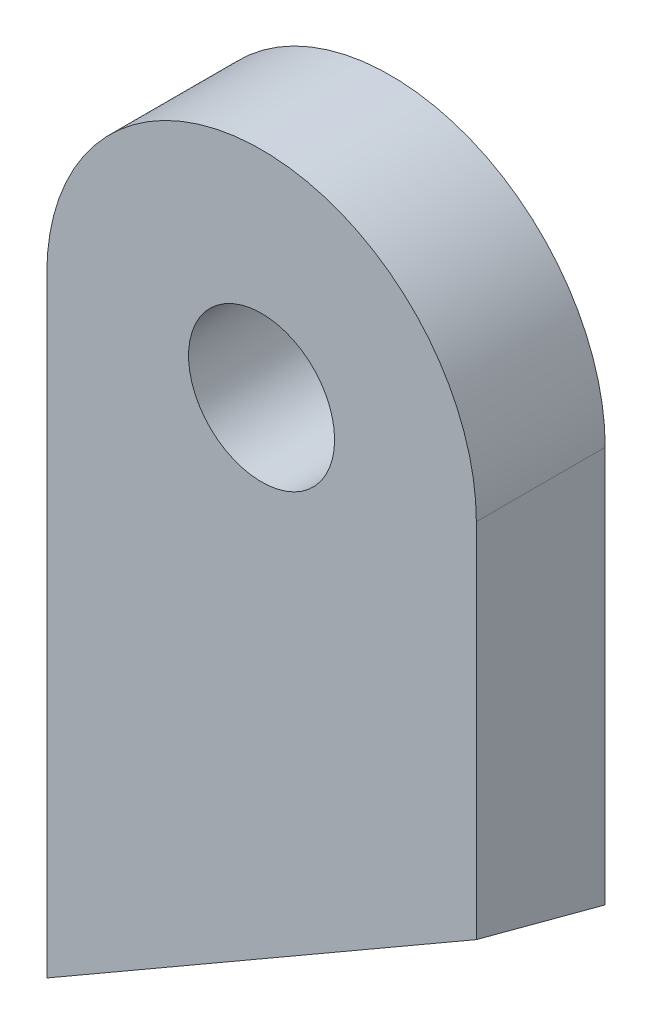
ISO-10303-21;
HEADER;
FILE_DESCRIPTION(('STEP AP214'),'2;1');
FILE_NAME('part.step','',(''),(''),'','','');
FILE_SCHEMA(('AUTOMOTIVE_DESIGN { 1 0 10303 214 1 1 1 1 }'));
ENDSEC;
DATA;
#1=APPLICATION_CONTEXT('core data for automotive mechanical design processes');
#2=APPLICATION_PROTOCOL_DEFINITION('international standard','automotive_design',2000,#1);
#3=PRODUCT_CONTEXT('',#1,'mechanical');
#4=PRODUCT('Part','Part','',(#3));
#5=PRODUCT_RELATED_PRODUCT_CATEGORY('part','',(#4));
#6=PRODUCT_DEFINITION_FORMATION('','',#4);
#7=PRODUCT_DEFINITION_CONTEXT('part definition',#1,'design');
#8=PRODUCT_DEFINITION('design','',#6,#7);
#9=PRODUCT_DEFINITION_SHAPE('','',#8);
#10=(LENGTH_UNIT() NAMED_UNIT(*) SI_UNIT(.MILLI.,.METRE.));
#11=(NAMED_UNIT(*) PLANE_ANGLE_UNIT() SI_UNIT($,.RADIAN.));
#12=(NAMED_UNIT(*) SI_UNIT($,.STERADIAN.) SOLID_ANGLE_UNIT());
#13=UNCERTAINTY_MEASURE_WITH_UNIT(LENGTH_MEASURE(1.E-05),#10,'distance_accuracy_value','');
#14=(GEOMETRIC_REPRESENTATION_CONTEXT(3) GLOBAL_UNCERTAINTY_ASSIGNED_CONTEXT((#13)) GLOBAL_UNIT_ASSIGNED_CONTEXT((#10,
#11,#12)) REPRESENTATION_CONTEXT('',''));
#15=CARTESIAN_POINT('',(0.,0.,0.));
#16=DIRECTION('',(0.,0.,1.));
#17=DIRECTION('',(1.,0.,0.));
#18=AXIS2_PLACEMENT_3D('',#15,#16,#17);
#19=CARTESIAN_POINT('',(0.,75.,0.));
#20=DIRECTION('',(0.,0.,1.));
#21=DIRECTION('',(1.,0.,0.));
#22=AXIS2_PLACEMENT_3D('',#19,#20,#21);
#23=CYLINDRICAL_SURFACE('',#22,25.);
#24=CARTESIAN_POINT('',(0.,75.,0.));
#25=DIRECTION('',(0.,0.,1.));
#26=DIRECTION('',(1.,0.,0.));
#27=AXIS2_PLACEMENT_3D('',#24,#25,#26);
#28=CIRCLE('',#27,25.);
#29=CARTESIAN_POINT('',(25.,75.,0.));
#30=VERTEX_POINT('',#29);
#31=CARTESIAN_POINT('',(-25.,75.,0.));
#32=VERTEX_POINT('',#31);
#33=EDGE_CURVE('E116',#30,#32,#28,.T.);
#34=ORIENTED_EDGE('',*,*,#33,.T.);
#35=DIRECTION('',(0.,0.,1.));
#36=VECTOR('',#35,1.);
#37=CARTESIAN_POINT('',(-25.,75.,0.));
#38=LINE('',#37,#36);
#39=CARTESIAN_POINT('',(-25.,75.,15.));
#40=VERTEX_POINT('',#39);
#41=EDGE_CURVE('E11',#32,#40,#38,.T.);
#42=ORIENTED_EDGE('',*,*,#41,.T.);
#43=CARTESIAN_POINT('',(0.,75.,15.));
#44=DIRECTION('',(0.,0.,1.));
#45=DIRECTION('',(1.,0.,0.));
#46=AXIS2_PLACEMENT_3D('',#43,#44,#45);
#47=CIRCLE('',#46,25.);
#48=CARTESIAN_POINT('',(25.,75.,15.));
#49=VERTEX_POINT('',#48);
#50=EDGE_CURVE('E87',#49,#40,#47,.T.);
#51=ORIENTED_EDGE('',*,*,#50,.F.);
#52=DIRECTION('',(0.,0.,1.));
#53=VECTOR('',#52,1.);
#54=CARTESIAN_POINT('',(25.,75.,0.));
#55=LINE('',#54,#53);
#56=EDGE_CURVE('E82',#30,#49,#55,.T.);
#57=ORIENTED_EDGE('',*,*,#56,.F.);
#58=EDGE_LOOP('',(#34,#42,#51,#57));
#59=FACE_BOUND('',#58,.T.);
#60=ADVANCED_FACE('F17',(#59),#23,.T.);
#61=CARTESIAN_POINT('',(-25.,75.,0.));
#62=DIRECTION('',(-1.,0.,0.));
#63=DIRECTION('',(0.,1.,0.));
#64=AXIS2_PLACEMENT_3D('',#61,#62,#63);
#65=PLANE('',#64);
#66=DIRECTION('',(0.,-0.257587737093544,-0.966254913415206));
#67=VECTOR('',#66,1.);
#68=CARTESIAN_POINT('',(-25.,3.82673011298148,14.3547080917113));
#69=LINE('',#68,#67);
#70=CARTESIAN_POINT('',(-25.,3.99875436880997,15.));
#71=VERTEX_POINT('',#70);
#72=CARTESIAN_POINT('',(-25.,0.,0.));
#73=VERTEX_POINT('',#72);
#74=EDGE_CURVE('E99',#71,#73,#69,.T.);
#75=ORIENTED_EDGE('',*,*,#74,.F.);
#76=DIRECTION('',(0.,-1.,0.));
#77=VECTOR('',#76,1.);
#78=CARTESIAN_POINT('',(-25.,75.,15.));
#79=LINE('',#78,#77);
#80=EDGE_CURVE('E94',#40,#71,#79,.T.);
#81=ORIENTED_EDGE('',*,*,#80,.F.);
#82=ORIENTED_EDGE('',*,*,#41,.F.);
#83=DIRECTION('',(0.,-1.,0.));
#84=VECTOR('',#83,1.);
#85=CARTESIAN_POINT('',(-25.,75.,0.));
#86=LINE('',#85,#84);
#87=EDGE_CURVE('E114',#32,#73,#86,.T.);
#88=ORIENTED_EDGE('',*,*,#87,.T.);
#89=EDGE_LOOP('',(#75,#81,#82,#88));
#90=FACE_BOUND('',#89,.T.);
#91=ADVANCED_FACE('F136',(#90),#65,.T.);
#92=CARTESIAN_POINT('',(0.,75.,0.));
#93=DIRECTION('',(0.,0.,1.));
#94=DIRECTION('',(-1.,0.,0.));
#95=AXIS2_PLACEMENT_3D('',#92,#93,#94);
#96=CYLINDRICAL_SURFACE('',#95,8.5);
#97=CARTESIAN_POINT('',(0.,75.,0.));
#98=DIRECTION('',(0.,0.,1.));
#99=DIRECTION('',(-1.,0.,0.));
#100=AXIS2_PLACEMENT_3D('',#97,#98,#99);
#101=CIRCLE('',#100,8.5);
#102=CARTESIAN_POINT('',(8.5,75.,0.));
#103=VERTEX_POINT('',#102);
#104=EDGE_CURVE('E121',#103,#103,#101,.T.);
#105=ORIENTED_EDGE('',*,*,#104,.F.);
#106=DIRECTION('',(0.,0.,1.));
#107=VECTOR('',#106,1.);
#108=CARTESIAN_POINT('',(8.5,75.,0.));
#109=LINE('',#108,#107);
#110=CARTESIAN_POINT('',(8.5,75.,15.));
#111=VERTEX_POINT('',#110);
#112=EDGE_CURVE('E21',#103,#111,#109,.T.);
#113=ORIENTED_EDGE('',*,*,#112,.T.);
#114=CARTESIAN_POINT('',(0.,75.,15.));
#115=DIRECTION('',(0.,0.,-1.));
#116=DIRECTION('',(-1.,0.,0.));
#117=AXIS2_PLACEMENT_3D('',#114,#115,#116);
#118=CIRCLE('',#117,8.5);
#119=EDGE_CURVE('E113',#111,#111,#118,.T.);
#120=ORIENTED_EDGE('',*,*,#119,.F.);
#121=ORIENTED_EDGE('',*,*,#112,.F.);
#122=EDGE_LOOP('',(#105,#113,#120,#121));
#123=FACE_BOUND('',#122,.T.);
#124=ADVANCED_FACE('F19',(#123),#96,.F.);
#125=CARTESIAN_POINT('',(0.,42.4108390647284,0.));
#126=DIRECTION('',(0.,0.,1.));
#127=DIRECTION('',(1.,0.,0.));
#128=AXIS2_PLACEMENT_3D('',#125,#126,#127);
#129=PLANE('',#128);
#130=ORIENTED_EDGE('',*,*,#104,.T.);
#131=EDGE_LOOP('',(#130));
#132=FACE_BOUND('',#131,.T.);
#133=DIRECTION('',(-0.866025403784439,-0.5,0.));
#134=VECTOR('',#133,1.);
#135=CARTESIAN_POINT('',(-6.44278399353293,10.7140136567438,0.));
#136=LINE('',#135,#134);
#137=CARTESIAN_POINT('',(25.,28.8675134594813,0.));
#138=VERTEX_POINT('',#137);
#139=EDGE_CURVE('E88',#138,#73,#136,.T.);
#140=ORIENTED_EDGE('',*,*,#139,.T.);
#141=ORIENTED_EDGE('',*,*,#87,.F.);
#142=ORIENTED_EDGE('',*,*,#33,.F.);
#143=DIRECTION('',(0.,1.,0.));
#144=VECTOR('',#143,1.);
#145=CARTESIAN_POINT('',(25.,0.,0.));
#146=LINE('',#145,#144);
#147=EDGE_CURVE('E118',#138,#30,#146,.T.);
#148=ORIENTED_EDGE('',*,*,#147,.F.);
#149=EDGE_LOOP('',(#140,#141,#142,#148));
#150=FACE_BOUND('',#149,.T.);
#151=ADVANCED_FACE('F214',(#132,#150),#129,.F.);
#152=CARTESIAN_POINT('',(25.,0.,0.));
#153=DIRECTION('',(1.,0.,0.));
#154=DIRECTION('',(0.,-1.,0.));
#155=AXIS2_PLACEMENT_3D('',#152,#153,#154);
#156=PLANE('',#155);
#157=DIRECTION('',(0.,0.257587737093544,0.966254913415206));
#158=VECTOR('',#157,1.);
#159=CARTESIAN_POINT('',(25.,28.290663332497,-2.16386181963454));
#160=LINE('',#159,#158);
#161=CARTESIAN_POINT('',(25.,32.8662678282913,15.));
#162=VERTEX_POINT('',#161);
#163=EDGE_CURVE('E80',#138,#162,#160,.T.);
#164=ORIENTED_EDGE('',*,*,#163,.F.);
#165=ORIENTED_EDGE('',*,*,#147,.T.);
#166=ORIENTED_EDGE('',*,*,#56,.T.);
#167=DIRECTION('',(0.,1.,0.));
#168=VECTOR('',#167,1.);
#169=CARTESIAN_POINT('',(25.,0.,15.));
#170=LINE('',#169,#168);
#171=EDGE_CURVE('E75',#162,#49,#170,.T.);
#172=ORIENTED_EDGE('',*,*,#171,.F.);
#173=EDGE_LOOP('',(#164,#165,#166,#172));
#174=FACE_BOUND('',#173,.T.);
#175=ADVANCED_FACE('F77',(#174),#156,.T.);
#176=CARTESIAN_POINT('',(0.,42.4108390647284,15.));
#177=DIRECTION('',(0.,0.,1.));
#178=DIRECTION('',(1.,0.,0.));
#179=AXIS2_PLACEMENT_3D('',#176,#177,#178);
#180=PLANE('',#179);
#181=ORIENTED_EDGE('',*,*,#119,.T.);
#182=EDGE_LOOP('',(#181));
#183=FACE_BOUND('',#182,.T.);
#184=DIRECTION('',(-0.866025403784439,-0.5,0.));
#185=VECTOR('',#184,1.);
#186=CARTESIAN_POINT('',(-8.17429542697466,13.7130794333513,15.));
#187=LINE('',#186,#185);
#188=EDGE_CURVE('E91',#162,#71,#187,.T.);
#189=ORIENTED_EDGE('',*,*,#188,.F.);
#190=ORIENTED_EDGE('',*,*,#171,.T.);
#191=ORIENTED_EDGE('',*,*,#50,.T.);
#192=ORIENTED_EDGE('',*,*,#80,.T.);
#193=EDGE_LOOP('',(#189,#190,#191,#192));
#194=FACE_BOUND('',#193,.T.);
#195=ADVANCED_FACE('F92',(#183,#194),#180,.T.);
#196=CARTESIAN_POINT('',(-7.3085397102538,12.2135465450475,7.5));
#197=DIRECTION('',(0.487185032392618,-0.843829228791103,0.224951054343865));
#198=DIRECTION('',(0.,-0.257587737093544,-0.966254913415206));
#199=AXIS2_PLACEMENT_3D('',#196,#197,#198);
#200=PLANE('',#199);
#201=ORIENTED_EDGE('',*,*,#163,.T.);
#202=ORIENTED_EDGE('',*,*,#188,.T.);
#203=ORIENTED_EDGE('',*,*,#74,.T.);
#204=ORIENTED_EDGE('',*,*,#139,.F.);
#205=EDGE_LOOP('',(#201,#202,#203,#204));
#206=FACE_BOUND('',#205,.T.);
#207=ADVANCED_FACE('F102',(#206),#200,.T.);
#208=CLOSED_SHELL('',(#60,#91,#124,#151,#175,#195,#207));
#209=MANIFOLD_SOLID_BREP('B1',#208);
#210=ADVANCED_BREP_SHAPE_REPRESENTATION('',(#18,#209),#14);
#211=SHAPE_DEFINITION_REPRESENTATION(#9,#210);
ENDSEC;
END-ISO-10303-21;
